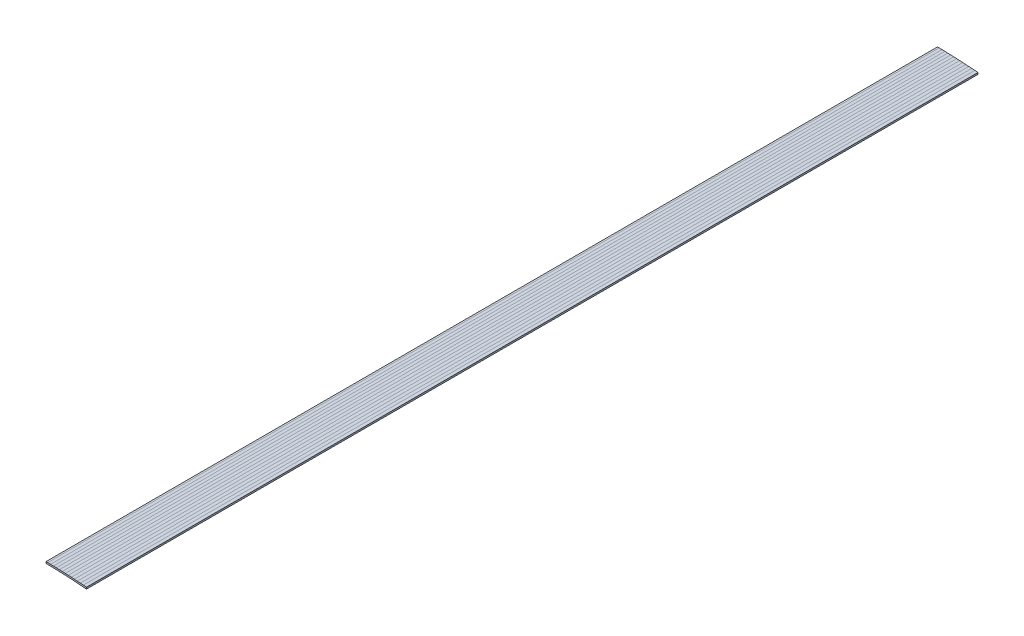
ISO-10303-21;
HEADER;
FILE_DESCRIPTION(('STEP AP214'),'2;1');
FILE_NAME('part.step','',(''),(''),'','','');
FILE_SCHEMA(('AUTOMOTIVE_DESIGN { 1 0 10303 214 1 1 1 1 }'));
ENDSEC;
DATA;
#1=APPLICATION_CONTEXT('core data for automotive mechanical design processes');
#2=APPLICATION_PROTOCOL_DEFINITION('international standard','automotive_design',2000,#1);
#3=PRODUCT_CONTEXT('',#1,'mechanical');
#4=PRODUCT('Part','Part','',(#3));
#5=PRODUCT_RELATED_PRODUCT_CATEGORY('part','',(#4));
#6=PRODUCT_DEFINITION_FORMATION('','',#4);
#7=PRODUCT_DEFINITION_CONTEXT('part definition',#1,'design');
#8=PRODUCT_DEFINITION('design','',#6,#7);
#9=PRODUCT_DEFINITION_SHAPE('','',#8);
#10=(LENGTH_UNIT() NAMED_UNIT(*) SI_UNIT(.MILLI.,.METRE.));
#11=(NAMED_UNIT(*) PLANE_ANGLE_UNIT() SI_UNIT($,.RADIAN.));
#12=(NAMED_UNIT(*) SI_UNIT($,.STERADIAN.) SOLID_ANGLE_UNIT());
#13=UNCERTAINTY_MEASURE_WITH_UNIT(LENGTH_MEASURE(1.E-05),#10,'distance_accuracy_value','');
#14=(GEOMETRIC_REPRESENTATION_CONTEXT(3) GLOBAL_UNCERTAINTY_ASSIGNED_CONTEXT((#13)) GLOBAL_UNIT_ASSIGNED_CONTEXT((#10,
#11,#12)) REPRESENTATION_CONTEXT('',''));
#15=CARTESIAN_POINT('',(0.,0.,0.));
#16=DIRECTION('',(0.,0.,1.));
#17=DIRECTION('',(1.,0.,0.));
#18=AXIS2_PLACEMENT_3D('',#15,#16,#17);
#19=CARTESIAN_POINT('',(12.,2.02787441749079,220.));
#20=DIRECTION('',(-0.00779734988343685,-0.999969600205324,0.));
#21=DIRECTION('',(0.999969600205324,-0.00779734988343685,0.));
#22=AXIS2_PLACEMENT_3D('',#19,#20,#21);
#23=PLANE('',#22);
#24=DIRECTION('',(-0.999969600205324,0.00779734988343685,0.));
#25=VECTOR('',#24,1.);
#26=CARTESIAN_POINT('',(12.,2.02787441749079,0.));
#27=LINE('',#26,#25);
#28=CARTESIAN_POINT('',(12.4208971980884,2.02459243500074,0.));
#29=VERTEX_POINT('',#28);
#30=CARTESIAN_POINT('',(12.,2.02787441749079,0.));
#31=VERTEX_POINT('',#30);
#32=EDGE_CURVE('E282',#29,#31,#27,.T.);
#33=ORIENTED_EDGE('',*,*,#32,.T.);
#34=DIRECTION('',(0.,0.,-1.));
#35=VECTOR('',#34,1.);
#36=CARTESIAN_POINT('',(12.,2.02787441749079,220.));
#37=LINE('',#36,#35);
#38=CARTESIAN_POINT('',(12.,2.02787441749079,220.));
#39=VERTEX_POINT('',#38);
#40=EDGE_CURVE('E11',#39,#31,#37,.T.);
#41=ORIENTED_EDGE('',*,*,#40,.F.);
#42=DIRECTION('',(-0.999969600205324,0.00779734988343685,0.));
#43=VECTOR('',#42,1.);
#44=CARTESIAN_POINT('',(12.,2.02787441749079,220.));
#45=LINE('',#44,#43);
#46=CARTESIAN_POINT('',(12.4208971980884,2.02459243500074,220.));
#47=VERTEX_POINT('',#46);
#48=EDGE_CURVE('E345',#47,#39,#45,.T.);
#49=ORIENTED_EDGE('',*,*,#48,.F.);
#50=DIRECTION('',(0.,0.,-1.));
#51=VECTOR('',#50,1.);
#52=CARTESIAN_POINT('',(12.4208971980884,2.02459243500074,220.));
#53=LINE('',#52,#51);
#54=EDGE_CURVE('E280',#47,#29,#53,.T.);
#55=ORIENTED_EDGE('',*,*,#54,.T.);
#56=EDGE_LOOP('',(#33,#41,#49,#55));
#57=FACE_BOUND('',#56,.T.);
#58=ADVANCED_FACE('F41',(#57),#23,.F.);
#59=CARTESIAN_POINT('',(12.,1.62786225720325,220.));
#60=DIRECTION('',(1.,0.,0.));
#61=DIRECTION('',(0.,0.,-1.));
#62=AXIS2_PLACEMENT_3D('',#59,#60,#61);
#63=PLANE('',#62);
#64=DIRECTION('',(0.,-1.,0.));
#65=VECTOR('',#64,1.);
#66=CARTESIAN_POINT('',(12.,1.62786225720325,0.));
#67=LINE('',#66,#65);
#68=CARTESIAN_POINT('',(12.,1.62786225720325,0.));
#69=VERTEX_POINT('',#68);
#70=EDGE_CURVE('E281',#31,#69,#67,.T.);
#71=ORIENTED_EDGE('',*,*,#70,.T.);
#72=DIRECTION('',(0.,0.,-1.));
#73=VECTOR('',#72,1.);
#74=CARTESIAN_POINT('',(12.,1.62786225720325,220.));
#75=LINE('',#74,#73);
#76=CARTESIAN_POINT('',(12.,1.62786225720325,220.));
#77=VERTEX_POINT('',#76);
#78=EDGE_CURVE('E47',#77,#69,#75,.T.);
#79=ORIENTED_EDGE('',*,*,#78,.F.);
#80=DIRECTION('',(0.,-1.,0.));
#81=VECTOR('',#80,1.);
#82=CARTESIAN_POINT('',(12.,1.62786225720325,220.));
#83=LINE('',#82,#81);
#84=EDGE_CURVE('E175',#39,#77,#83,.T.);
#85=ORIENTED_EDGE('',*,*,#84,.F.);
#86=ORIENTED_EDGE('',*,*,#40,.T.);
#87=EDGE_LOOP('',(#71,#79,#85,#86));
#88=FACE_BOUND('',#87,.T.);
#89=ADVANCED_FACE('F522',(#88),#63,.F.);
#90=CARTESIAN_POINT('',(12.4162912501855,1.62461618999236,220.));
#91=DIRECTION('',(0.00779734988343794,0.999969600205324,0.));
#92=DIRECTION('',(-0.999969600205324,0.00779734988343794,0.));
#93=AXIS2_PLACEMENT_3D('',#90,#91,#92);
#94=PLANE('',#93);
#95=DIRECTION('',(0.999969600205324,-0.00779734988343794,0.));
#96=VECTOR('',#95,1.);
#97=CARTESIAN_POINT('',(12.4162912501855,1.62461618999236,0.));
#98=LINE('',#97,#96);
#99=CARTESIAN_POINT('',(12.4162912501855,1.62461618999236,0.));
#100=VERTEX_POINT('',#99);
#101=EDGE_CURVE('E287',#69,#100,#98,.T.);
#102=ORIENTED_EDGE('',*,*,#101,.T.);
#103=DIRECTION('',(0.,0.,-1.));
#104=VECTOR('',#103,1.);
#105=CARTESIAN_POINT('',(12.4162912501855,1.62461618999236,220.));
#106=LINE('',#105,#104);
#107=CARTESIAN_POINT('',(12.4162912501855,1.62461618999236,220.));
#108=VERTEX_POINT('',#107);
#109=EDGE_CURVE('E424',#108,#100,#106,.T.);
#110=ORIENTED_EDGE('',*,*,#109,.F.);
#111=DIRECTION('',(0.999969600205324,-0.00779734988343794,0.));
#112=VECTOR('',#111,1.);
#113=CARTESIAN_POINT('',(12.4162912501855,1.62461618999236,220.));
#114=LINE('',#113,#112);
#115=EDGE_CURVE('E428',#77,#108,#114,.T.);
#116=ORIENTED_EDGE('',*,*,#115,.F.);
#117=ORIENTED_EDGE('',*,*,#78,.T.);
#118=EDGE_LOOP('',(#102,#110,#116,#117));
#119=FACE_BOUND('',#118,.T.);
#120=ADVANCED_FACE('F426',(#119),#94,.F.);
#121=CARTESIAN_POINT('',(13.1165021581669,1.61394928996735,220.));
#122=DIRECTION('',(0.0152320713458354,0.999883985271549,0.));
#123=DIRECTION('',(-0.999883985271549,0.0152320713458354,0.));
#124=AXIS2_PLACEMENT_3D('',#121,#122,#123);
#125=PLANE('',#124);
#126=DIRECTION('',(0.999883985271549,-0.0152320713458354,0.));
#127=VECTOR('',#126,1.);
#128=CARTESIAN_POINT('',(13.1165021581669,1.61394928996735,0.));
#129=LINE('',#128,#127);
#130=CARTESIAN_POINT('',(13.1165021581669,1.61394928996735,0.));
#131=VERTEX_POINT('',#130);
#132=EDGE_CURVE('E290',#100,#131,#129,.T.);
#133=ORIENTED_EDGE('',*,*,#132,.T.);
#134=DIRECTION('',(0.,0.,-1.));
#135=VECTOR('',#134,1.);
#136=CARTESIAN_POINT('',(13.1165021581669,1.61394928996735,220.));
#137=LINE('',#136,#135);
#138=CARTESIAN_POINT('',(13.1165021581669,1.61394928996735,220.));
#139=VERTEX_POINT('',#138);
#140=EDGE_CURVE('E416',#139,#131,#137,.T.);
#141=ORIENTED_EDGE('',*,*,#140,.F.);
#142=DIRECTION('',(0.999883985271549,-0.0152320713458354,0.));
#143=VECTOR('',#142,1.);
#144=CARTESIAN_POINT('',(13.1165021581669,1.61394928996735,220.));
#145=LINE('',#144,#143);
#146=EDGE_CURVE('E448',#108,#139,#145,.T.);
#147=ORIENTED_EDGE('',*,*,#146,.F.);
#148=ORIENTED_EDGE('',*,*,#109,.T.);
#149=EDGE_LOOP('',(#133,#141,#147,#148));
#150=FACE_BOUND('',#149,.T.);
#151=ADVANCED_FACE('F440',(#150),#125,.F.);
#152=CARTESIAN_POINT('',(13.8260432724261,1.59817310834428,220.));
#153=DIRECTION('',(0.0222288506569368,0.999752908572149,0.));
#154=DIRECTION('',(-0.999752908572149,0.0222288506569368,0.));
#155=AXIS2_PLACEMENT_3D('',#152,#153,#154);
#156=PLANE('',#155);
#157=DIRECTION('',(0.999752908572149,-0.0222288506569368,0.));
#158=VECTOR('',#157,1.);
#159=CARTESIAN_POINT('',(13.8260432724261,1.59817310834428,0.));
#160=LINE('',#159,#158);
#161=CARTESIAN_POINT('',(13.8260432724261,1.59817310834428,0.));
#162=VERTEX_POINT('',#161);
#163=EDGE_CURVE('E288',#131,#162,#160,.T.);
#164=ORIENTED_EDGE('',*,*,#163,.T.);
#165=DIRECTION('',(0.,0.,-1.));
#166=VECTOR('',#165,1.);
#167=CARTESIAN_POINT('',(13.8260432724261,1.59817310834428,220.));
#168=LINE('',#167,#166);
#169=CARTESIAN_POINT('',(13.8260432724261,1.59817310834428,220.));
#170=VERTEX_POINT('',#169);
#171=EDGE_CURVE('E417',#170,#162,#168,.T.);
#172=ORIENTED_EDGE('',*,*,#171,.F.);
#173=DIRECTION('',(0.999752908572149,-0.0222288506569368,0.));
#174=VECTOR('',#173,1.);
#175=CARTESIAN_POINT('',(13.8260432724261,1.59817310834428,220.));
#176=LINE('',#175,#174);
#177=EDGE_CURVE('E442',#139,#170,#176,.T.);
#178=ORIENTED_EDGE('',*,*,#177,.F.);
#179=ORIENTED_EDGE('',*,*,#140,.T.);
#180=EDGE_LOOP('',(#164,#172,#178,#179));
#181=FACE_BOUND('',#180,.T.);
#182=ADVANCED_FACE('F441',(#181),#156,.F.);
#183=CARTESIAN_POINT('',(14.5437988273589,1.5774851569678,220.));
#184=DIRECTION('',(0.0288111503975783,0.999584872641022,0.));
#185=DIRECTION('',(-0.999584872641022,0.0288111503975783,0.));
#186=AXIS2_PLACEMENT_3D('',#183,#184,#185);
#187=PLANE('',#186);
#188=DIRECTION('',(0.999584872641022,-0.0288111503975783,0.));
#189=VECTOR('',#188,1.);
#190=CARTESIAN_POINT('',(14.5437988273589,1.5774851569678,0.));
#191=LINE('',#190,#189);
#192=CARTESIAN_POINT('',(14.5437988273589,1.5774851569678,0.));
#193=VERTEX_POINT('',#192);
#194=EDGE_CURVE('E295',#162,#193,#191,.T.);
#195=ORIENTED_EDGE('',*,*,#194,.T.);
#196=DIRECTION('',(0.,0.,-1.));
#197=VECTOR('',#196,1.);
#198=CARTESIAN_POINT('',(14.5437988273589,1.5774851569678,220.));
#199=LINE('',#198,#197);
#200=CARTESIAN_POINT('',(14.5437988273589,1.5774851569678,220.));
#201=VERTEX_POINT('',#200);
#202=EDGE_CURVE('E412',#201,#193,#199,.T.);
#203=ORIENTED_EDGE('',*,*,#202,.F.);
#204=DIRECTION('',(0.999584872641022,-0.0288111503975783,0.));
#205=VECTOR('',#204,1.);
#206=CARTESIAN_POINT('',(14.5437988273589,1.5774851569678,220.));
#207=LINE('',#206,#205);
#208=EDGE_CURVE('E450',#170,#201,#207,.T.);
#209=ORIENTED_EDGE('',*,*,#208,.F.);
#210=ORIENTED_EDGE('',*,*,#171,.T.);
#211=EDGE_LOOP('',(#195,#203,#209,#210));
#212=FACE_BOUND('',#211,.T.);
#213=ADVANCED_FACE('F534',(#212),#187,.F.);
#214=CARTESIAN_POINT('',(15.2686414152349,1.55209913770248,220.));
#215=DIRECTION('',(0.035001343455341,0.999387265256228,0.));
#216=DIRECTION('',(-0.999387265256228,0.035001343455341,0.));
#217=AXIS2_PLACEMENT_3D('',#214,#215,#216);
#218=PLANE('',#217);
#219=DIRECTION('',(0.999387265256228,-0.035001343455341,0.));
#220=VECTOR('',#219,1.);
#221=CARTESIAN_POINT('',(15.2686414152349,1.55209913770248,0.));
#222=LINE('',#221,#220);
#223=CARTESIAN_POINT('',(15.2686414152349,1.55209913770248,0.));
#224=VERTEX_POINT('',#223);
#225=EDGE_CURVE('E294',#193,#224,#222,.T.);
#226=ORIENTED_EDGE('',*,*,#225,.T.);
#227=DIRECTION('',(0.,0.,-1.));
#228=VECTOR('',#227,1.);
#229=CARTESIAN_POINT('',(15.2686414152349,1.55209913770248,220.));
#230=LINE('',#229,#228);
#231=CARTESIAN_POINT('',(15.2686414152349,1.55209913770248,220.));
#232=VERTEX_POINT('',#231);
#233=EDGE_CURVE('E409',#232,#224,#230,.T.);
#234=ORIENTED_EDGE('',*,*,#233,.F.);
#235=DIRECTION('',(0.999387265256228,-0.035001343455341,0.));
#236=VECTOR('',#235,1.);
#237=CARTESIAN_POINT('',(15.2686414152349,1.55209913770248,220.));
#238=LINE('',#237,#236);
#239=EDGE_CURVE('E449',#201,#232,#238,.T.);
#240=ORIENTED_EDGE('',*,*,#239,.F.);
#241=ORIENTED_EDGE('',*,*,#202,.T.);
#242=EDGE_LOOP('',(#226,#234,#240,#241));
#243=FACE_BOUND('',#242,.T.);
#244=ADVANCED_FACE('F540',(#243),#218,.F.);
#245=CARTESIAN_POINT('',(15.9994335484656,1.52224259514114,220.));
#246=DIRECTION('',(0.0408209873416693,0.999166476115192,0.));
#247=DIRECTION('',(-0.999166476115192,0.0408209873416693,0.));
#248=AXIS2_PLACEMENT_3D('',#245,#246,#247);
#249=PLANE('',#248);
#250=DIRECTION('',(0.999166476115192,-0.0408209873416693,0.));
#251=VECTOR('',#250,1.);
#252=CARTESIAN_POINT('',(15.9994335484656,1.52224259514114,0.));
#253=LINE('',#252,#251);
#254=CARTESIAN_POINT('',(15.9994335484656,1.52224259514114,0.));
#255=VERTEX_POINT('',#254);
#256=EDGE_CURVE('E297',#224,#255,#253,.T.);
#257=ORIENTED_EDGE('',*,*,#256,.T.);
#258=DIRECTION('',(0.,0.,-1.));
#259=VECTOR('',#258,1.);
#260=CARTESIAN_POINT('',(15.9994335484656,1.52224259514114,220.));
#261=LINE('',#260,#259);
#262=CARTESIAN_POINT('',(15.9994335484656,1.52224259514114,220.));
#263=VERTEX_POINT('',#262);
#264=EDGE_CURVE('E410',#263,#255,#261,.T.);
#265=ORIENTED_EDGE('',*,*,#264,.F.);
#266=DIRECTION('',(0.999166476115192,-0.0408209873416693,0.));
#267=VECTOR('',#266,1.);
#268=CARTESIAN_POINT('',(15.9994335484656,1.52224259514114,220.));
#269=LINE('',#268,#267);
#270=EDGE_CURVE('E456',#232,#263,#269,.T.);
#271=ORIENTED_EDGE('',*,*,#270,.F.);
#272=ORIENTED_EDGE('',*,*,#233,.T.);
#273=EDGE_LOOP('',(#257,#265,#271,#272));
#274=FACE_BOUND('',#273,.T.);
#275=ADVANCED_FACE('F541',(#274),#249,.F.);
#276=CARTESIAN_POINT('',(16.7350292827461,1.48815457307719,220.));
#277=DIRECTION('',(0.0462910236967297,0.99892799596623,0.));
#278=DIRECTION('',(-0.99892799596623,0.0462910236967297,0.));
#279=AXIS2_PLACEMENT_3D('',#276,#277,#278);
#280=PLANE('',#279);
#281=DIRECTION('',(0.99892799596623,-0.0462910236967297,0.));
#282=VECTOR('',#281,1.);
#283=CARTESIAN_POINT('',(16.7350292827461,1.48815457307719,0.));
#284=LINE('',#283,#282);
#285=CARTESIAN_POINT('',(16.7350292827461,1.48815457307719,0.));
#286=VERTEX_POINT('',#285);
#287=EDGE_CURVE('E300',#255,#286,#284,.T.);
#288=ORIENTED_EDGE('',*,*,#287,.T.);
#289=DIRECTION('',(0.,0.,-1.));
#290=VECTOR('',#289,1.);
#291=CARTESIAN_POINT('',(16.7350292827461,1.48815457307719,220.));
#292=LINE('',#291,#290);
#293=CARTESIAN_POINT('',(16.7350292827461,1.48815457307719,220.));
#294=VERTEX_POINT('',#293);
#295=EDGE_CURVE('E402',#294,#286,#292,.T.);
#296=ORIENTED_EDGE('',*,*,#295,.F.);
#297=DIRECTION('',(0.99892799596623,-0.0462910236967297,0.));
#298=VECTOR('',#297,1.);
#299=CARTESIAN_POINT('',(16.7350292827461,1.48815457307719,220.));
#300=LINE('',#299,#298);
#301=EDGE_CURVE('E457',#263,#294,#300,.T.);
#302=ORIENTED_EDGE('',*,*,#301,.F.);
#303=ORIENTED_EDGE('',*,*,#264,.T.);
#304=EDGE_LOOP('',(#288,#296,#302,#303));
#305=FACE_BOUND('',#304,.T.);
#306=ADVANCED_FACE('F544',(#305),#280,.F.);
#307=CARTESIAN_POINT('',(17.4742758909573,1.45008331687681,220.));
#308=DIRECTION('',(0.0514319154027312,0.998676503217136,0.));
#309=DIRECTION('',(-0.998676503217136,0.0514319154027312,0.));
#310=AXIS2_PLACEMENT_3D('',#307,#308,#309);
#311=PLANE('',#310);
#312=DIRECTION('',(0.998676503217136,-0.0514319154027312,0.));
#313=VECTOR('',#312,1.);
#314=CARTESIAN_POINT('',(17.4742758909573,1.45008331687681,0.));
#315=LINE('',#314,#313);
#316=CARTESIAN_POINT('',(17.4742758909573,1.45008331687681,0.));
#317=VERTEX_POINT('',#316);
#318=EDGE_CURVE('E298',#286,#317,#315,.T.);
#319=ORIENTED_EDGE('',*,*,#318,.T.);
#320=DIRECTION('',(0.,0.,-1.));
#321=VECTOR('',#320,1.);
#322=CARTESIAN_POINT('',(17.4742758909573,1.45008331687681,220.));
#323=LINE('',#322,#321);
#324=CARTESIAN_POINT('',(17.4742758909573,1.45008331687681,220.));
#325=VERTEX_POINT('',#324);
#326=EDGE_CURVE('E401',#325,#317,#323,.T.);
#327=ORIENTED_EDGE('',*,*,#326,.F.);
#328=DIRECTION('',(0.998676503217136,-0.0514319154027312,0.));
#329=VECTOR('',#328,1.);
#330=CARTESIAN_POINT('',(17.4742758909573,1.45008331687681,220.));
#331=LINE('',#330,#329);
#332=EDGE_CURVE('E459',#294,#325,#331,.T.);
#333=ORIENTED_EDGE('',*,*,#332,.F.);
#334=ORIENTED_EDGE('',*,*,#295,.T.);
#335=EDGE_LOOP('',(#319,#327,#333,#334));
#336=FACE_BOUND('',#335,.T.);
#337=ADVANCED_FACE('F548',(#336),#311,.F.);
#338=CARTESIAN_POINT('',(18.2160155788332,1.40828406157576,220.));
#339=DIRECTION('',(0.0562637317682948,0.998415941623282,0.));
#340=DIRECTION('',(-0.998415941623282,0.0562637317682948,0.));
#341=AXIS2_PLACEMENT_3D('',#338,#339,#340);
#342=PLANE('',#341);
#343=DIRECTION('',(0.998415941623282,-0.0562637317682948,0.));
#344=VECTOR('',#343,1.);
#345=CARTESIAN_POINT('',(18.2160155788332,1.40828406157576,0.));
#346=LINE('',#345,#344);
#347=CARTESIAN_POINT('',(18.2160155788332,1.40828406157576,0.));
#348=VERTEX_POINT('',#347);
#349=EDGE_CURVE('E302',#317,#348,#346,.T.);
#350=ORIENTED_EDGE('',*,*,#349,.T.);
#351=DIRECTION('',(0.,0.,-1.));
#352=VECTOR('',#351,1.);
#353=CARTESIAN_POINT('',(18.2160155788332,1.40828406157576,220.));
#354=LINE('',#353,#352);
#355=CARTESIAN_POINT('',(18.2160155788332,1.40828406157576,220.));
#356=VERTEX_POINT('',#355);
#357=EDGE_CURVE('E396',#356,#348,#354,.T.);
#358=ORIENTED_EDGE('',*,*,#357,.F.);
#359=DIRECTION('',(0.998415941623282,-0.0562637317682948,0.));
#360=VECTOR('',#359,1.);
#361=CARTESIAN_POINT('',(18.2160155788332,1.40828406157576,220.));
#362=LINE('',#361,#360);
#363=EDGE_CURVE('E465',#325,#356,#362,.T.);
#364=ORIENTED_EDGE('',*,*,#363,.F.);
#365=ORIENTED_EDGE('',*,*,#326,.T.);
#366=EDGE_LOOP('',(#350,#358,#364,#365));
#367=FACE_BOUND('',#366,.T.);
#368=ADVANCED_FACE('F554',(#367),#342,.F.);
#369=CARTESIAN_POINT('',(18.9590872342926,1.36301694213588,220.));
#370=DIRECTION('',(0.0608061906937295,0.998149591581,0.));
#371=DIRECTION('',(-0.998149591581,0.0608061906937295,0.));
#372=AXIS2_PLACEMENT_3D('',#369,#370,#371);
#373=PLANE('',#372);
#374=DIRECTION('',(0.998149591581,-0.0608061906937295,0.));
#375=VECTOR('',#374,1.);
#376=CARTESIAN_POINT('',(18.9590872342926,1.36301694213588,0.));
#377=LINE('',#376,#375);
#378=CARTESIAN_POINT('',(18.9590872342926,1.36301694213588,0.));
#379=VERTEX_POINT('',#378);
#380=EDGE_CURVE('E305',#348,#379,#377,.T.);
#381=ORIENTED_EDGE('',*,*,#380,.T.);
#382=DIRECTION('',(0.,0.,-1.));
#383=VECTOR('',#382,1.);
#384=CARTESIAN_POINT('',(18.9590872342926,1.36301694213588,220.));
#385=LINE('',#384,#383);
#386=CARTESIAN_POINT('',(18.9590872342926,1.36301694213588,220.));
#387=VERTEX_POINT('',#386);
#388=EDGE_CURVE('E394',#387,#379,#385,.T.);
#389=ORIENTED_EDGE('',*,*,#388,.F.);
#390=DIRECTION('',(0.998149591581,-0.0608061906937295,0.));
#391=VECTOR('',#390,1.);
#392=CARTESIAN_POINT('',(18.9590872342926,1.36301694213588,220.));
#393=LINE('',#392,#391);
#394=EDGE_CURVE('E461',#356,#387,#393,.T.);
#395=ORIENTED_EDGE('',*,*,#394,.F.);
#396=ORIENTED_EDGE('',*,*,#357,.T.);
#397=EDGE_LOOP('',(#381,#389,#395,#396));
#398=FACE_BOUND('',#397,.T.);
#399=ADVANCED_FACE('F559',(#398),#373,.F.);
#400=CARTESIAN_POINT('',(19.7023282030514,1.31454505798701,220.));
#401=DIRECTION('',(0.0650786654875173,0.997880136739059,0.));
#402=DIRECTION('',(-0.99788013673906,0.0650786654875173,0.));
#403=AXIS2_PLACEMENT_3D('',#400,#401,#402);
#404=PLANE('',#403);
#405=DIRECTION('',(0.997880136739059,-0.0650786654875173,0.));
#406=VECTOR('',#405,1.);
#407=CARTESIAN_POINT('',(19.7023282030514,1.31454505798701,0.));
#408=LINE('',#407,#406);
#409=CARTESIAN_POINT('',(19.7023282030514,1.31454505798701,0.));
#410=VERTEX_POINT('',#409);
#411=EDGE_CURVE('E308',#379,#410,#408,.T.);
#412=ORIENTED_EDGE('',*,*,#411,.T.);
#413=DIRECTION('',(0.,0.,-1.));
#414=VECTOR('',#413,1.);
#415=CARTESIAN_POINT('',(19.7023282030514,1.31454505798701,220.));
#416=LINE('',#415,#414);
#417=CARTESIAN_POINT('',(19.7023282030514,1.31454505798701,220.));
#418=VERTEX_POINT('',#417);
#419=EDGE_CURVE('E392',#418,#410,#416,.T.);
#420=ORIENTED_EDGE('',*,*,#419,.F.);
#421=DIRECTION('',(0.997880136739059,-0.0650786654875173,0.));
#422=VECTOR('',#421,1.);
#423=CARTESIAN_POINT('',(19.7023282030514,1.31454505798701,220.));
#424=LINE('',#423,#422);
#425=EDGE_CURVE('E467',#387,#418,#424,.T.);
#426=ORIENTED_EDGE('',*,*,#425,.F.);
#427=ORIENTED_EDGE('',*,*,#388,.T.);
#428=EDGE_LOOP('',(#412,#420,#426,#427));
#429=FACE_BOUND('',#428,.T.);
#430=ADVANCED_FACE('F562',(#429),#404,.F.);
#431=CARTESIAN_POINT('',(20.4445760837068,1.26313271891831,220.));
#432=DIRECTION('',(0.0691001630064702,0.997609727033813,0.));
#433=DIRECTION('',(-0.997609727033813,0.0691001630064702,0.));
#434=AXIS2_PLACEMENT_3D('',#431,#432,#433);
#435=PLANE('',#434);
#436=DIRECTION('',(0.997609727033813,-0.0691001630064702,0.));
#437=VECTOR('',#436,1.);
#438=CARTESIAN_POINT('',(20.4445760837068,1.26313271891831,0.));
#439=LINE('',#438,#437);
#440=CARTESIAN_POINT('',(20.4445760837068,1.26313271891831,0.));
#441=VERTEX_POINT('',#440);
#442=EDGE_CURVE('E306',#410,#441,#439,.T.);
#443=ORIENTED_EDGE('',*,*,#442,.T.);
#444=DIRECTION('',(0.,0.,-1.));
#445=VECTOR('',#444,1.);
#446=CARTESIAN_POINT('',(20.4445760837068,1.26313271891831,220.));
#447=LINE('',#446,#445);
#448=CARTESIAN_POINT('',(20.4445760837068,1.26313271891831,220.));
#449=VERTEX_POINT('',#448);
#450=EDGE_CURVE('E386',#449,#441,#447,.T.);
#451=ORIENTED_EDGE('',*,*,#450,.F.);
#452=DIRECTION('',(0.997609727033813,-0.0691001630064702,0.));
#453=VECTOR('',#452,1.);
#454=CARTESIAN_POINT('',(20.4445760837068,1.26313271891831,220.));
#455=LINE('',#454,#453);
#456=EDGE_CURVE('E470',#418,#449,#455,.T.);
#457=ORIENTED_EDGE('',*,*,#456,.F.);
#458=ORIENTED_EDGE('',*,*,#419,.T.);
#459=EDGE_LOOP('',(#443,#451,#457,#458));
#460=FACE_BOUND('',#459,.T.);
#461=ADVANCED_FACE('F563',(#460),#435,.F.);
#462=CARTESIAN_POINT('',(21.1846705359667,1.20904389373843,220.));
#463=DIRECTION('',(0.0728892789822354,0.997340038807953,0.));
#464=DIRECTION('',(-0.997340038807954,0.0728892789822355,0.));
#465=AXIS2_PLACEMENT_3D('',#462,#463,#464);
#466=PLANE('',#465);
#467=DIRECTION('',(0.997340038807953,-0.0728892789822354,0.));
#468=VECTOR('',#467,1.);
#469=CARTESIAN_POINT('',(21.1846705359667,1.20904389373843,0.));
#470=LINE('',#469,#468);
#471=CARTESIAN_POINT('',(21.1846705359667,1.20904389373843,0.));
#472=VERTEX_POINT('',#471);
#473=EDGE_CURVE('E307',#441,#472,#470,.T.);
#474=ORIENTED_EDGE('',*,*,#473,.T.);
#475=DIRECTION('',(0.,0.,-1.));
#476=VECTOR('',#475,1.);
#477=CARTESIAN_POINT('',(21.1846705359667,1.20904389373843,220.));
#478=LINE('',#477,#476);
#479=CARTESIAN_POINT('',(21.1846705359667,1.20904389373843,220.));
#480=VERTEX_POINT('',#479);
#481=EDGE_CURVE('E387',#480,#472,#478,.T.);
#482=ORIENTED_EDGE('',*,*,#481,.F.);
#483=DIRECTION('',(0.997340038807953,-0.0728892789822354,0.));
#484=VECTOR('',#483,1.);
#485=CARTESIAN_POINT('',(21.1846705359667,1.20904389373843,220.));
#486=LINE('',#485,#484);
#487=EDGE_CURVE('E468',#449,#480,#486,.T.);
#488=ORIENTED_EDGE('',*,*,#487,.F.);
#489=ORIENTED_EDGE('',*,*,#450,.T.);
#490=EDGE_LOOP('',(#474,#482,#488,#489));
#491=FACE_BOUND('',#490,.T.);
#492=ADVANCED_FACE('F566',(#491),#466,.F.);
#493=CARTESIAN_POINT('',(21.9214550960875,1.1525408770745,220.));
#494=DIRECTION('',(0.0764641357318034,0.997072332354473,0.));
#495=DIRECTION('',(-0.997072332354473,0.0764641357318034,0.));
#496=AXIS2_PLACEMENT_3D('',#493,#494,#495);
#497=PLANE('',#496);
#498=DIRECTION('',(0.997072332354473,-0.0764641357318034,0.));
#499=VECTOR('',#498,1.);
#500=CARTESIAN_POINT('',(21.9214550960875,1.1525408770745,0.));
#501=LINE('',#500,#499);
#502=CARTESIAN_POINT('',(21.9214550960875,1.1525408770745,0.));
#503=VERTEX_POINT('',#502);
#504=EDGE_CURVE('E315',#472,#503,#501,.T.);
#505=ORIENTED_EDGE('',*,*,#504,.T.);
#506=DIRECTION('',(0.,0.,-1.));
#507=VECTOR('',#506,1.);
#508=CARTESIAN_POINT('',(21.9214550960875,1.1525408770745,220.));
#509=LINE('',#508,#507);
#510=CARTESIAN_POINT('',(21.9214550960875,1.1525408770745,220.));
#511=VERTEX_POINT('',#510);
#512=EDGE_CURVE('E381',#511,#503,#509,.T.);
#513=ORIENTED_EDGE('',*,*,#512,.F.);
#514=DIRECTION('',(0.997072332354473,-0.0764641357318034,0.));
#515=VECTOR('',#514,1.);
#516=CARTESIAN_POINT('',(21.9214550960875,1.1525408770745,220.));
#517=LINE('',#516,#515);
#518=EDGE_CURVE('E475',#480,#511,#517,.T.);
#519=ORIENTED_EDGE('',*,*,#518,.F.);
#520=ORIENTED_EDGE('',*,*,#481,.T.);
#521=EDGE_LOOP('',(#505,#513,#519,#520));
#522=FACE_BOUND('',#521,.T.);
#523=ADVANCED_FACE('F571',(#522),#497,.F.);
#524=CARTESIAN_POINT('',(22.,1.14624958584804,220.));
#525=DIRECTION('',(0.0798423068961165,0.996807507009004,0.));
#526=DIRECTION('',(-0.996807507009005,0.0798423068961166,0.));
#527=AXIS2_PLACEMENT_3D('',#524,#525,#526);
#528=PLANE('',#527);
#529=DIRECTION('',(0.996807507009004,-0.0798423068961165,0.));
#530=VECTOR('',#529,1.);
#531=CARTESIAN_POINT('',(22.,1.14624958584804,0.));
#532=LINE('',#531,#530);
#533=CARTESIAN_POINT('',(22.,1.14624958584804,0.));
#534=VERTEX_POINT('',#533);
#535=EDGE_CURVE('E312',#503,#534,#532,.T.);
#536=ORIENTED_EDGE('',*,*,#535,.T.);
#537=DIRECTION('',(0.,0.,-1.));
#538=VECTOR('',#537,1.);
#539=CARTESIAN_POINT('',(22.,1.14624958584804,220.));
#540=LINE('',#539,#538);
#541=CARTESIAN_POINT('',(22.,1.14624958584804,220.));
#542=VERTEX_POINT('',#541);
#543=EDGE_CURVE('E378',#542,#534,#540,.T.);
#544=ORIENTED_EDGE('',*,*,#543,.F.);
#545=DIRECTION('',(0.996807507009004,-0.0798423068961165,0.));
#546=VECTOR('',#545,1.);
#547=CARTESIAN_POINT('',(22.,1.14624958584804,220.));
#548=LINE('',#547,#546);
#549=EDGE_CURVE('E474',#511,#542,#548,.T.);
#550=ORIENTED_EDGE('',*,*,#549,.F.);
#551=ORIENTED_EDGE('',*,*,#512,.T.);
#552=EDGE_LOOP('',(#536,#544,#550,#551));
#553=FACE_BOUND('',#552,.T.);
#554=ADVANCED_FACE('F580',(#553),#528,.F.);
#555=CARTESIAN_POINT('',(22.,1.5475306729059,220.));
#556=DIRECTION('',(-1.,0.,0.));
#557=DIRECTION('',(0.,0.,1.));
#558=AXIS2_PLACEMENT_3D('',#555,#556,#557);
#559=PLANE('',#558);
#560=DIRECTION('',(0.,1.,0.));
#561=VECTOR('',#560,1.);
#562=CARTESIAN_POINT('',(22.,1.5475306729059,0.));
#563=LINE('',#562,#561);
#564=CARTESIAN_POINT('',(22.,1.5475306729059,0.));
#565=VERTEX_POINT('',#564);
#566=EDGE_CURVE('E316',#534,#565,#563,.T.);
#567=ORIENTED_EDGE('',*,*,#566,.T.);
#568=DIRECTION('',(0.,0.,-1.));
#569=VECTOR('',#568,1.);
#570=CARTESIAN_POINT('',(22.,1.5475306729059,220.));
#571=LINE('',#570,#569);
#572=CARTESIAN_POINT('',(22.,1.5475306729059,220.));
#573=VERTEX_POINT('',#572);
#574=EDGE_CURVE('E379',#573,#565,#571,.T.);
#575=ORIENTED_EDGE('',*,*,#574,.F.);
#576=DIRECTION('',(0.,1.,0.));
#577=VECTOR('',#576,1.);
#578=CARTESIAN_POINT('',(22.,1.5475306729059,220.));
#579=LINE('',#578,#577);
#580=EDGE_CURVE('E477',#542,#573,#579,.T.);
#581=ORIENTED_EDGE('',*,*,#580,.F.);
#582=ORIENTED_EDGE('',*,*,#543,.T.);
#583=EDGE_LOOP('',(#567,#575,#581,#582));
#584=FACE_BOUND('',#583,.T.);
#585=ADVANCED_FACE('F581',(#584),#559,.F.);
#586=CARTESIAN_POINT('',(21.9527164743502,1.55131798965413,220.));
#587=DIRECTION('',(-0.0798423068961218,-0.996807507009004,0.));
#588=DIRECTION('',(0.996807507009004,-0.0798423068961218,0.));
#589=AXIS2_PLACEMENT_3D('',#586,#587,#588);
#590=PLANE('',#589);
#591=DIRECTION('',(-0.996807507009004,0.0798423068961218,0.));
#592=VECTOR('',#591,1.);
#593=CARTESIAN_POINT('',(21.9527164743502,1.55131798965413,0.));
#594=LINE('',#593,#592);
#595=CARTESIAN_POINT('',(21.9527164743502,1.55131798965413,0.));
#596=VERTEX_POINT('',#595);
#597=EDGE_CURVE('E318',#565,#596,#594,.T.);
#598=ORIENTED_EDGE('',*,*,#597,.T.);
#599=DIRECTION('',(0.,0.,-1.));
#600=VECTOR('',#599,1.);
#601=CARTESIAN_POINT('',(21.9527164743502,1.55131798965413,220.));
#602=LINE('',#601,#600);
#603=CARTESIAN_POINT('',(21.9527164743502,1.55131798965413,220.));
#604=VERTEX_POINT('',#603);
#605=EDGE_CURVE('E371',#604,#596,#602,.T.);
#606=ORIENTED_EDGE('',*,*,#605,.F.);
#607=DIRECTION('',(-0.996807507009004,0.0798423068961218,0.));
#608=VECTOR('',#607,1.);
#609=CARTESIAN_POINT('',(21.9527164743502,1.55131798965413,220.));
#610=LINE('',#609,#608);
#611=EDGE_CURVE('E480',#573,#604,#610,.T.);
#612=ORIENTED_EDGE('',*,*,#611,.F.);
#613=ORIENTED_EDGE('',*,*,#574,.T.);
#614=EDGE_LOOP('',(#598,#606,#612,#613));
#615=FACE_BOUND('',#614,.T.);
#616=ADVANCED_FACE('F584',(#615),#590,.F.);
#617=CARTESIAN_POINT('',(21.2145413148788,1.60792764951138,220.));
#618=DIRECTION('',(-0.076464135731803,-0.997072332354473,0.));
#619=DIRECTION('',(0.997072332354473,-0.076464135731803,0.));
#620=AXIS2_PLACEMENT_3D('',#617,#618,#619);
#621=PLANE('',#620);
#622=DIRECTION('',(-0.997072332354473,0.076464135731803,0.));
#623=VECTOR('',#622,1.);
#624=CARTESIAN_POINT('',(21.2145413148788,1.60792764951138,0.));
#625=LINE('',#624,#623);
#626=CARTESIAN_POINT('',(21.2145413148788,1.60792764951138,0.));
#627=VERTEX_POINT('',#626);
#628=EDGE_CURVE('E319',#596,#627,#625,.T.);
#629=ORIENTED_EDGE('',*,*,#628,.T.);
#630=DIRECTION('',(0.,0.,-1.));
#631=VECTOR('',#630,1.);
#632=CARTESIAN_POINT('',(21.2145413148788,1.60792764951138,220.));
#633=LINE('',#632,#631);
#634=CARTESIAN_POINT('',(21.2145413148788,1.60792764951138,220.));
#635=VERTEX_POINT('',#634);
#636=EDGE_CURVE('E372',#635,#627,#633,.T.);
#637=ORIENTED_EDGE('',*,*,#636,.F.);
#638=DIRECTION('',(-0.997072332354473,0.076464135731803,0.));
#639=VECTOR('',#638,1.);
#640=CARTESIAN_POINT('',(21.2145413148788,1.60792764951138,220.));
#641=LINE('',#640,#639);
#642=EDGE_CURVE('E478',#604,#635,#641,.T.);
#643=ORIENTED_EDGE('',*,*,#642,.F.);
#644=ORIENTED_EDGE('',*,*,#605,.T.);
#645=EDGE_LOOP('',(#629,#637,#643,#644));
#646=FACE_BOUND('',#645,.T.);
#647=ADVANCED_FACE('F587',(#646),#621,.F.);
#648=CARTESIAN_POINT('',(20.4729740745513,1.66212411146124,220.));
#649=DIRECTION('',(-0.0728892789822352,-0.997340038807953,0.));
#650=DIRECTION('',(0.997340038807953,-0.0728892789822352,0.));
#651=AXIS2_PLACEMENT_3D('',#648,#649,#650);
#652=PLANE('',#651);
#653=DIRECTION('',(-0.997340038807953,0.0728892789822352,0.));
#654=VECTOR('',#653,1.);
#655=CARTESIAN_POINT('',(20.4729740745513,1.66212411146124,0.));
#656=LINE('',#655,#654);
#657=CARTESIAN_POINT('',(20.4729740745513,1.66212411146124,0.));
#658=VERTEX_POINT('',#657);
#659=EDGE_CURVE('E325',#627,#658,#656,.T.);
#660=ORIENTED_EDGE('',*,*,#659,.T.);
#661=DIRECTION('',(0.,0.,-1.));
#662=VECTOR('',#661,1.);
#663=CARTESIAN_POINT('',(20.4729740745513,1.66212411146124,220.));
#664=LINE('',#663,#662);
#665=CARTESIAN_POINT('',(20.4729740745513,1.66212411146124,220.));
#666=VERTEX_POINT('',#665);
#667=EDGE_CURVE('E367',#666,#658,#664,.T.);
#668=ORIENTED_EDGE('',*,*,#667,.F.);
#669=DIRECTION('',(-0.997340038807953,0.0728892789822352,0.));
#670=VECTOR('',#669,1.);
#671=CARTESIAN_POINT('',(20.4729740745513,1.66212411146124,220.));
#672=LINE('',#671,#670);
#673=EDGE_CURVE('E482',#635,#666,#672,.T.);
#674=ORIENTED_EDGE('',*,*,#673,.F.);
#675=ORIENTED_EDGE('',*,*,#636,.T.);
#676=EDGE_LOOP('',(#660,#668,#674,#675));
#677=FACE_BOUND('',#676,.T.);
#678=ADVANCED_FACE('F592',(#677),#652,.F.);
#679=CARTESIAN_POINT('',(19.7291640777412,1.71364465164105,220.));
#680=DIRECTION('',(-0.0691001630064706,-0.997609727033813,0.));
#681=DIRECTION('',(0.997609727033813,-0.0691001630064706,0.));
#682=AXIS2_PLACEMENT_3D('',#679,#680,#681);
#683=PLANE('',#682);
#684=DIRECTION('',(-0.997609727033813,0.0691001630064706,0.));
#685=VECTOR('',#684,1.);
#686=CARTESIAN_POINT('',(19.7291640777412,1.71364465164105,0.));
#687=LINE('',#686,#685);
#688=CARTESIAN_POINT('',(19.7291640777412,1.71364465164105,0.));
#689=VERTEX_POINT('',#688);
#690=EDGE_CURVE('E323',#658,#689,#687,.T.);
#691=ORIENTED_EDGE('',*,*,#690,.T.);
#692=DIRECTION('',(0.,0.,-1.));
#693=VECTOR('',#692,1.);
#694=CARTESIAN_POINT('',(19.7291640777412,1.71364465164105,220.));
#695=LINE('',#694,#693);
#696=CARTESIAN_POINT('',(19.7291640777412,1.71364465164105,220.));
#697=VERTEX_POINT('',#696);
#698=EDGE_CURVE('E364',#697,#689,#695,.T.);
#699=ORIENTED_EDGE('',*,*,#698,.F.);
#700=DIRECTION('',(-0.997609727033813,0.0691001630064706,0.));
#701=VECTOR('',#700,1.);
#702=CARTESIAN_POINT('',(19.7291640777412,1.71364465164105,220.));
#703=LINE('',#702,#701);
#704=EDGE_CURVE('E485',#666,#697,#703,.T.);
#705=ORIENTED_EDGE('',*,*,#704,.F.);
#706=ORIENTED_EDGE('',*,*,#667,.T.);
#707=EDGE_LOOP('',(#691,#699,#705,#706));
#708=FACE_BOUND('',#707,.T.);
#709=ADVANCED_FACE('F600',(#708),#683,.F.);
#710=CARTESIAN_POINT('',(18.9842643208818,1.76222471683486,220.));
#711=DIRECTION('',(-0.0650786654875169,-0.997880136739059,0.));
#712=DIRECTION('',(0.99788013673906,-0.065078665487517,0.));
#713=AXIS2_PLACEMENT_3D('',#710,#711,#712);
#714=PLANE('',#713);
#715=DIRECTION('',(-0.99788013673906,0.065078665487517,0.));
#716=VECTOR('',#715,1.);
#717=CARTESIAN_POINT('',(18.9842643208818,1.76222471683486,0.));
#718=LINE('',#717,#716);
#719=CARTESIAN_POINT('',(18.9842643208818,1.76222471683486,0.));
#720=VERTEX_POINT('',#719);
#721=EDGE_CURVE('E327',#689,#720,#718,.T.);
#722=ORIENTED_EDGE('',*,*,#721,.T.);
#723=DIRECTION('',(0.,0.,-1.));
#724=VECTOR('',#723,1.);
#725=CARTESIAN_POINT('',(18.9842643208818,1.76222471683486,220.));
#726=LINE('',#725,#724);
#727=CARTESIAN_POINT('',(18.9842643208818,1.76222471683486,220.));
#728=VERTEX_POINT('',#727);
#729=EDGE_CURVE('E365',#728,#720,#726,.T.);
#730=ORIENTED_EDGE('',*,*,#729,.F.);
#731=DIRECTION('',(-0.99788013673906,0.065078665487517,0.));
#732=VECTOR('',#731,1.);
#733=CARTESIAN_POINT('',(18.9842643208818,1.76222471683486,220.));
#734=LINE('',#733,#732);
#735=EDGE_CURVE('E488',#697,#728,#734,.T.);
#736=ORIENTED_EDGE('',*,*,#735,.F.);
#737=ORIENTED_EDGE('',*,*,#698,.T.);
#738=EDGE_LOOP('',(#722,#730,#736,#737));
#739=FACE_BOUND('',#738,.T.);
#740=ADVANCED_FACE('F602',(#739),#714,.F.);
#741=CARTESIAN_POINT('',(18.2394296845221,1.80759923515935,220.));
#742=DIRECTION('',(-0.0608061906937291,-0.998149591581,0.));
#743=DIRECTION('',(0.998149591581,-0.0608061906937291,0.));
#744=AXIS2_PLACEMENT_3D('',#741,#742,#743);
#745=PLANE('',#744);
#746=DIRECTION('',(-0.998149591581,0.0608061906937291,0.));
#747=VECTOR('',#746,1.);
#748=CARTESIAN_POINT('',(18.2394296845221,1.80759923515935,0.));
#749=LINE('',#748,#747);
#750=CARTESIAN_POINT('',(18.2394296845221,1.80759923515935,0.));
#751=VERTEX_POINT('',#750);
#752=EDGE_CURVE('E329',#720,#751,#749,.T.);
#753=ORIENTED_EDGE('',*,*,#752,.T.);
#754=DIRECTION('',(0.,0.,-1.));
#755=VECTOR('',#754,1.);
#756=CARTESIAN_POINT('',(18.2394296845221,1.80759923515935,220.));
#757=LINE('',#756,#755);
#758=CARTESIAN_POINT('',(18.2394296845221,1.80759923515935,220.));
#759=VERTEX_POINT('',#758);
#760=EDGE_CURVE('E357',#759,#751,#757,.T.);
#761=ORIENTED_EDGE('',*,*,#760,.F.);
#762=DIRECTION('',(-0.998149591581,0.0608061906937291,0.));
#763=VECTOR('',#762,1.);
#764=CARTESIAN_POINT('',(18.2394296845221,1.80759923515935,220.));
#765=LINE('',#764,#763);
#766=EDGE_CURVE('E486',#728,#759,#765,.T.);
#767=ORIENTED_EDGE('',*,*,#766,.F.);
#768=ORIENTED_EDGE('',*,*,#729,.T.);
#769=EDGE_LOOP('',(#753,#761,#767,#768));
#770=FACE_BOUND('',#769,.T.);
#771=ADVANCED_FACE('F603',(#770),#745,.F.);
#772=CARTESIAN_POINT('',(17.4958151464734,1.84950414388883,220.));
#773=DIRECTION('',(-0.0562637317682948,-0.998415941623282,0.));
#774=DIRECTION('',(0.998415941623282,-0.0562637317682948,0.));
#775=AXIS2_PLACEMENT_3D('',#772,#773,#774);
#776=PLANE('',#775);
#777=DIRECTION('',(-0.998415941623282,0.0562637317682948,0.));
#778=VECTOR('',#777,1.);
#779=CARTESIAN_POINT('',(17.4958151464734,1.84950414388883,0.));
#780=LINE('',#779,#778);
#781=CARTESIAN_POINT('',(17.4958151464734,1.84950414388883,0.));
#782=VERTEX_POINT('',#781);
#783=EDGE_CURVE('E328',#751,#782,#780,.T.);
#784=ORIENTED_EDGE('',*,*,#783,.T.);
#785=DIRECTION('',(0.,0.,-1.));
#786=VECTOR('',#785,1.);
#787=CARTESIAN_POINT('',(17.4958151464734,1.84950414388883,220.));
#788=LINE('',#787,#786);
#789=CARTESIAN_POINT('',(17.4958151464734,1.84950414388883,220.));
#790=VERTEX_POINT('',#789);
#791=EDGE_CURVE('E356',#790,#782,#788,.T.);
#792=ORIENTED_EDGE('',*,*,#791,.F.);
#793=DIRECTION('',(-0.998415941623282,0.0562637317682948,0.));
#794=VECTOR('',#793,1.);
#795=CARTESIAN_POINT('',(17.4958151464734,1.84950414388883,220.));
#796=LINE('',#795,#794);
#797=EDGE_CURVE('E487',#759,#790,#796,.T.);
#798=ORIENTED_EDGE('',*,*,#797,.F.);
#799=ORIENTED_EDGE('',*,*,#760,.T.);
#800=EDGE_LOOP('',(#784,#792,#798,#799));
#801=FACE_BOUND('',#800,.T.);
#802=ADVANCED_FACE('F609',(#801),#776,.F.);
#803=CARTESIAN_POINT('',(16.7545740000107,1.88767811895992,220.));
#804=DIRECTION('',(-0.0514319154027315,-0.998676503217136,0.));
#805=DIRECTION('',(0.998676503217136,-0.0514319154027315,0.));
#806=AXIS2_PLACEMENT_3D('',#803,#804,#805);
#807=PLANE('',#806);
#808=DIRECTION('',(-0.998676503217136,0.0514319154027315,0.));
#809=VECTOR('',#808,1.);
#810=CARTESIAN_POINT('',(16.7545740000107,1.88767811895992,0.));
#811=LINE('',#810,#809);
#812=CARTESIAN_POINT('',(16.7545740000107,1.88767811895992,0.));
#813=VERTEX_POINT('',#812);
#814=EDGE_CURVE('E334',#782,#813,#811,.T.);
#815=ORIENTED_EDGE('',*,*,#814,.T.);
#816=DIRECTION('',(0.,0.,-1.));
#817=VECTOR('',#816,1.);
#818=CARTESIAN_POINT('',(16.7545740000107,1.88767811895992,220.));
#819=LINE('',#818,#817);
#820=CARTESIAN_POINT('',(16.7545740000107,1.88767811895992,220.));
#821=VERTEX_POINT('',#820);
#822=EDGE_CURVE('E351',#821,#813,#819,.T.);
#823=ORIENTED_EDGE('',*,*,#822,.F.);
#824=DIRECTION('',(-0.998676503217136,0.0514319154027315,0.));
#825=VECTOR('',#824,1.);
#826=CARTESIAN_POINT('',(16.7545740000107,1.88767811895992,220.));
#827=LINE('',#826,#825);
#828=EDGE_CURVE('E495',#790,#821,#827,.T.);
#829=ORIENTED_EDGE('',*,*,#828,.F.);
#830=ORIENTED_EDGE('',*,*,#791,.T.);
#831=EDGE_LOOP('',(#815,#823,#829,#830));
#832=FACE_BOUND('',#831,.T.);
#833=ADVANCED_FACE('F615',(#832),#807,.F.);
#834=CARTESIAN_POINT('',(16.0168560812471,1.92186448454071,220.));
#835=DIRECTION('',(-0.0462910236967294,-0.99892799596623,0.));
#836=DIRECTION('',(0.99892799596623,-0.0462910236967294,0.));
#837=AXIS2_PLACEMENT_3D('',#834,#835,#836);
#838=PLANE('',#837);
#839=DIRECTION('',(-0.99892799596623,0.0462910236967294,0.));
#840=VECTOR('',#839,1.);
#841=CARTESIAN_POINT('',(16.0168560812471,1.92186448454071,0.));
#842=LINE('',#841,#840);
#843=CARTESIAN_POINT('',(16.0168560812471,1.92186448454071,0.));
#844=VERTEX_POINT('',#843);
#845=EDGE_CURVE('E331',#813,#844,#842,.T.);
#846=ORIENTED_EDGE('',*,*,#845,.T.);
#847=DIRECTION('',(0.,0.,-1.));
#848=VECTOR('',#847,1.);
#849=CARTESIAN_POINT('',(16.0168560812471,1.92186448454071,220.));
#850=LINE('',#849,#848);
#851=CARTESIAN_POINT('',(16.0168560812471,1.92186448454071,220.));
#852=VERTEX_POINT('',#851);
#853=EDGE_CURVE('E349',#852,#844,#850,.T.);
#854=ORIENTED_EDGE('',*,*,#853,.F.);
#855=DIRECTION('',(-0.99892799596623,0.0462910236967294,0.));
#856=VECTOR('',#855,1.);
#857=CARTESIAN_POINT('',(16.0168560812471,1.92186448454071,220.));
#858=LINE('',#857,#856);
#859=EDGE_CURVE('E492',#821,#852,#858,.T.);
#860=ORIENTED_EDGE('',*,*,#859,.F.);
#861=ORIENTED_EDGE('',*,*,#822,.T.);
#862=EDGE_LOOP('',(#846,#854,#860,#861));
#863=FACE_BOUND('',#862,.T.);
#864=ADVANCED_FACE('F617',(#863),#838,.F.);
#865=CARTESIAN_POINT('',(15.2838060099787,1.95181327525315,220.));
#866=DIRECTION('',(-0.0408209873416697,-0.999166476115192,0.));
#867=DIRECTION('',(0.999166476115192,-0.0408209873416697,0.));
#868=AXIS2_PLACEMENT_3D('',#865,#866,#867);
#869=PLANE('',#868);
#870=DIRECTION('',(-0.999166476115192,0.0408209873416697,0.));
#871=VECTOR('',#870,1.);
#872=CARTESIAN_POINT('',(15.2838060099787,1.95181327525315,0.));
#873=LINE('',#872,#871);
#874=CARTESIAN_POINT('',(15.2838060099787,1.95181327525315,0.));
#875=VERTEX_POINT('',#874);
#876=EDGE_CURVE('E337',#844,#875,#873,.T.);
#877=ORIENTED_EDGE('',*,*,#876,.T.);
#878=DIRECTION('',(0.,0.,-1.));
#879=VECTOR('',#878,1.);
#880=CARTESIAN_POINT('',(15.2838060099787,1.95181327525315,220.));
#881=LINE('',#880,#879);
#882=CARTESIAN_POINT('',(15.2838060099787,1.95181327525315,220.));
#883=VERTEX_POINT('',#882);
#884=EDGE_CURVE('E347',#883,#875,#881,.T.);
#885=ORIENTED_EDGE('',*,*,#884,.F.);
#886=DIRECTION('',(-0.999166476115192,0.0408209873416697,0.));
#887=VECTOR('',#886,1.);
#888=CARTESIAN_POINT('',(15.2838060099787,1.95181327525315,220.));
#889=LINE('',#888,#887);
#890=EDGE_CURVE('E496',#852,#883,#889,.T.);
#891=ORIENTED_EDGE('',*,*,#890,.F.);
#892=ORIENTED_EDGE('',*,*,#853,.T.);
#893=EDGE_LOOP('',(#877,#885,#891,#892));
#894=FACE_BOUND('',#893,.T.);
#895=ADVANCED_FACE('F505',(#894),#869,.F.);
#896=CARTESIAN_POINT('',(14.5565614485151,1.97728341836657,220.));
#897=DIRECTION('',(-0.035001343455341,-0.999387265256228,0.));
#898=DIRECTION('',(0.999387265256228,-0.035001343455341,0.));
#899=AXIS2_PLACEMENT_3D('',#896,#897,#898);
#900=PLANE('',#899);
#901=DIRECTION('',(-0.999387265256228,0.035001343455341,0.));
#902=VECTOR('',#901,1.);
#903=CARTESIAN_POINT('',(14.5565614485151,1.97728341836657,0.));
#904=LINE('',#903,#902);
#905=CARTESIAN_POINT('',(14.5565614485151,1.97728341836657,0.));
#906=VERTEX_POINT('',#905);
#907=EDGE_CURVE('E336',#875,#906,#904,.T.);
#908=ORIENTED_EDGE('',*,*,#907,.T.);
#909=DIRECTION('',(0.,0.,-1.));
#910=VECTOR('',#909,1.);
#911=CARTESIAN_POINT('',(14.5565614485151,1.97728341836657,220.));
#912=LINE('',#911,#910);
#913=CARTESIAN_POINT('',(14.5565614485151,1.97728341836657,220.));
#914=VERTEX_POINT('',#913);
#915=EDGE_CURVE('E275',#914,#906,#912,.T.);
#916=ORIENTED_EDGE('',*,*,#915,.F.);
#917=DIRECTION('',(-0.999387265256228,0.035001343455341,0.));
#918=VECTOR('',#917,1.);
#919=CARTESIAN_POINT('',(14.5565614485151,1.97728341836657,220.));
#920=LINE('',#919,#918);
#921=EDGE_CURVE('E261',#883,#914,#920,.T.);
#922=ORIENTED_EDGE('',*,*,#921,.F.);
#923=ORIENTED_EDGE('',*,*,#884,.T.);
#924=EDGE_LOOP('',(#908,#916,#922,#923));
#925=FACE_BOUND('',#924,.T.);
#926=ADVANCED_FACE('F507',(#925),#900,.F.);
#927=CARTESIAN_POINT('',(13.8362513832799,1.99804499868896,220.));
#928=DIRECTION('',(-0.0288111503975779,-0.999584872641022,0.));
#929=DIRECTION('',(0.999584872641022,-0.0288111503975779,0.));
#930=AXIS2_PLACEMENT_3D('',#927,#928,#929);
#931=PLANE('',#930);
#932=DIRECTION('',(-0.999584872641022,0.0288111503975779,0.));
#933=VECTOR('',#932,1.);
#934=CARTESIAN_POINT('',(13.8362513832799,1.99804499868896,0.));
#935=LINE('',#934,#933);
#936=CARTESIAN_POINT('',(13.8362513832799,1.99804499868896,0.));
#937=VERTEX_POINT('',#936);
#938=EDGE_CURVE('E271',#906,#937,#935,.T.);
#939=ORIENTED_EDGE('',*,*,#938,.T.);
#940=DIRECTION('',(0.,0.,-1.));
#941=VECTOR('',#940,1.);
#942=CARTESIAN_POINT('',(13.8362513832799,1.99804499868896,220.));
#943=LINE('',#942,#941);
#944=CARTESIAN_POINT('',(13.8362513832799,1.99804499868896,220.));
#945=VERTEX_POINT('',#944);
#946=EDGE_CURVE('E268',#945,#937,#943,.T.);
#947=ORIENTED_EDGE('',*,*,#946,.F.);
#948=DIRECTION('',(-0.999584872641022,0.0288111503975779,0.));
#949=VECTOR('',#948,1.);
#950=CARTESIAN_POINT('',(13.8362513832799,1.99804499868896,220.));
#951=LINE('',#950,#949);
#952=EDGE_CURVE('E257',#914,#945,#951,.T.);
#953=ORIENTED_EDGE('',*,*,#952,.F.);
#954=ORIENTED_EDGE('',*,*,#915,.T.);
#955=EDGE_LOOP('',(#939,#947,#953,#954));
#956=FACE_BOUND('',#955,.T.);
#957=ADVANCED_FACE('F267',(#956),#931,.F.);
#958=CARTESIAN_POINT('',(13.1239944342956,2.01388156511711,220.));
#959=DIRECTION('',(-0.0222288506569369,-0.999752908572149,0.));
#960=DIRECTION('',(0.999752908572149,-0.0222288506569369,0.));
#961=AXIS2_PLACEMENT_3D('',#958,#959,#960);
#962=PLANE('',#961);
#963=DIRECTION('',(-0.999752908572149,0.0222288506569369,0.));
#964=VECTOR('',#963,1.);
#965=CARTESIAN_POINT('',(13.1239944342956,2.01388156511711,0.));
#966=LINE('',#965,#964);
#967=CARTESIAN_POINT('',(13.1239944342956,2.01388156511711,0.));
#968=VERTEX_POINT('',#967);
#969=EDGE_CURVE('E156',#937,#968,#966,.T.);
#970=ORIENTED_EDGE('',*,*,#969,.T.);
#971=DIRECTION('',(0.,0.,-1.));
#972=VECTOR('',#971,1.);
#973=CARTESIAN_POINT('',(13.1239944342956,2.01388156511711,220.));
#974=LINE('',#973,#972);
#975=CARTESIAN_POINT('',(13.1239944342956,2.01388156511711,220.));
#976=VERTEX_POINT('',#975);
#977=EDGE_CURVE('E273',#976,#968,#974,.T.);
#978=ORIENTED_EDGE('',*,*,#977,.F.);
#979=DIRECTION('',(-0.999752908572149,0.0222288506569369,0.));
#980=VECTOR('',#979,1.);
#981=CARTESIAN_POINT('',(13.1239944342956,2.01388156511711,220.));
#982=LINE('',#981,#980);
#983=EDGE_CURVE('E263',#945,#976,#982,.T.);
#984=ORIENTED_EDGE('',*,*,#983,.F.);
#985=ORIENTED_EDGE('',*,*,#946,.T.);
#986=EDGE_LOOP('',(#970,#978,#984,#985));
#987=FACE_BOUND('',#986,.T.);
#988=ADVANCED_FACE('F274',(#987),#962,.F.);
#989=CARTESIAN_POINT('',(12.4208971980884,2.02459243500074,220.));
#990=DIRECTION('',(-0.0152320713458356,-0.999883985271549,0.));
#991=DIRECTION('',(0.999883985271549,-0.0152320713458356,0.));
#992=AXIS2_PLACEMENT_3D('',#989,#990,#991);
#993=PLANE('',#992);
#994=DIRECTION('',(-0.999883985271549,0.0152320713458356,0.));
#995=VECTOR('',#994,1.);
#996=CARTESIAN_POINT('',(12.4208971980884,2.02459243500074,0.));
#997=LINE('',#996,#995);
#998=EDGE_CURVE('E161',#968,#29,#997,.T.);
#999=ORIENTED_EDGE('',*,*,#998,.T.);
#1000=ORIENTED_EDGE('',*,*,#54,.F.);
#1001=DIRECTION('',(-0.999883985271549,0.0152320713458356,0.));
#1002=VECTOR('',#1001,1.);
#1003=CARTESIAN_POINT('',(12.4208971980884,2.02459243500074,220.));
#1004=LINE('',#1003,#1002);
#1005=EDGE_CURVE('E60',#976,#47,#1004,.T.);
#1006=ORIENTED_EDGE('',*,*,#1005,.F.);
#1007=ORIENTED_EDGE('',*,*,#977,.T.);
#1008=EDGE_LOOP('',(#999,#1000,#1006,#1007));
#1009=FACE_BOUND('',#1008,.T.);
#1010=ADVANCED_FACE('F508',(#1009),#993,.F.);
#1011=CARTESIAN_POINT('',(0.,0.,220.));
#1012=DIRECTION('',(0.,0.,-1.));
#1013=DIRECTION('',(-1.,0.,0.));
#1014=AXIS2_PLACEMENT_3D('',#1011,#1012,#1013);
#1015=PLANE('',#1014);
#1016=ORIENTED_EDGE('',*,*,#48,.T.);
#1017=ORIENTED_EDGE('',*,*,#84,.T.);
#1018=ORIENTED_EDGE('',*,*,#115,.T.);
#1019=ORIENTED_EDGE('',*,*,#146,.T.);
#1020=ORIENTED_EDGE('',*,*,#177,.T.);
#1021=ORIENTED_EDGE('',*,*,#208,.T.);
#1022=ORIENTED_EDGE('',*,*,#239,.T.);
#1023=ORIENTED_EDGE('',*,*,#270,.T.);
#1024=ORIENTED_EDGE('',*,*,#301,.T.);
#1025=ORIENTED_EDGE('',*,*,#332,.T.);
#1026=ORIENTED_EDGE('',*,*,#363,.T.);
#1027=ORIENTED_EDGE('',*,*,#394,.T.);
#1028=ORIENTED_EDGE('',*,*,#425,.T.);
#1029=ORIENTED_EDGE('',*,*,#456,.T.);
#1030=ORIENTED_EDGE('',*,*,#487,.T.);
#1031=ORIENTED_EDGE('',*,*,#518,.T.);
#1032=ORIENTED_EDGE('',*,*,#549,.T.);
#1033=ORIENTED_EDGE('',*,*,#580,.T.);
#1034=ORIENTED_EDGE('',*,*,#611,.T.);
#1035=ORIENTED_EDGE('',*,*,#642,.T.);
#1036=ORIENTED_EDGE('',*,*,#673,.T.);
#1037=ORIENTED_EDGE('',*,*,#704,.T.);
#1038=ORIENTED_EDGE('',*,*,#735,.T.);
#1039=ORIENTED_EDGE('',*,*,#766,.T.);
#1040=ORIENTED_EDGE('',*,*,#797,.T.);
#1041=ORIENTED_EDGE('',*,*,#828,.T.);
#1042=ORIENTED_EDGE('',*,*,#859,.T.);
#1043=ORIENTED_EDGE('',*,*,#890,.T.);
#1044=ORIENTED_EDGE('',*,*,#921,.T.);
#1045=ORIENTED_EDGE('',*,*,#952,.T.);
#1046=ORIENTED_EDGE('',*,*,#983,.T.);
#1047=ORIENTED_EDGE('',*,*,#1005,.T.);
#1048=EDGE_LOOP('',(#1016,#1017,#1018,#1019,#1020,#1021,#1022,#1023,#1024,#1025,#1026,#1027,
#1028,#1029,#1030,#1031,#1032,#1033,#1034,#1035,#1036,#1037,#1038,#1039,#1040,#1041,#1042,#1043,
#1044,#1045,#1046,#1047));
#1049=FACE_BOUND('',#1048,.T.);
#1050=ADVANCED_FACE('F260',(#1049),#1015,.F.);
#1051=CARTESIAN_POINT('',(0.,0.,0.));
#1052=DIRECTION('',(0.,0.,-1.));
#1053=DIRECTION('',(-1.,0.,0.));
#1054=AXIS2_PLACEMENT_3D('',#1051,#1052,#1053);
#1055=PLANE('',#1054);
#1056=ORIENTED_EDGE('',*,*,#32,.F.);
#1057=ORIENTED_EDGE('',*,*,#998,.F.);
#1058=ORIENTED_EDGE('',*,*,#969,.F.);
#1059=ORIENTED_EDGE('',*,*,#938,.F.);
#1060=ORIENTED_EDGE('',*,*,#907,.F.);
#1061=ORIENTED_EDGE('',*,*,#876,.F.);
#1062=ORIENTED_EDGE('',*,*,#845,.F.);
#1063=ORIENTED_EDGE('',*,*,#814,.F.);
#1064=ORIENTED_EDGE('',*,*,#783,.F.);
#1065=ORIENTED_EDGE('',*,*,#752,.F.);
#1066=ORIENTED_EDGE('',*,*,#721,.F.);
#1067=ORIENTED_EDGE('',*,*,#690,.F.);
#1068=ORIENTED_EDGE('',*,*,#659,.F.);
#1069=ORIENTED_EDGE('',*,*,#628,.F.);
#1070=ORIENTED_EDGE('',*,*,#597,.F.);
#1071=ORIENTED_EDGE('',*,*,#566,.F.);
#1072=ORIENTED_EDGE('',*,*,#535,.F.);
#1073=ORIENTED_EDGE('',*,*,#504,.F.);
#1074=ORIENTED_EDGE('',*,*,#473,.F.);
#1075=ORIENTED_EDGE('',*,*,#442,.F.);
#1076=ORIENTED_EDGE('',*,*,#411,.F.);
#1077=ORIENTED_EDGE('',*,*,#380,.F.);
#1078=ORIENTED_EDGE('',*,*,#349,.F.);
#1079=ORIENTED_EDGE('',*,*,#318,.F.);
#1080=ORIENTED_EDGE('',*,*,#287,.F.);
#1081=ORIENTED_EDGE('',*,*,#256,.F.);
#1082=ORIENTED_EDGE('',*,*,#225,.F.);
#1083=ORIENTED_EDGE('',*,*,#194,.F.);
#1084=ORIENTED_EDGE('',*,*,#163,.F.);
#1085=ORIENTED_EDGE('',*,*,#132,.F.);
#1086=ORIENTED_EDGE('',*,*,#101,.F.);
#1087=ORIENTED_EDGE('',*,*,#70,.F.);
#1088=EDGE_LOOP('',(#1056,#1057,#1058,#1059,#1060,#1061,#1062,#1063,#1064,#1065,#1066,#1067,
#1068,#1069,#1070,#1071,#1072,#1073,#1074,#1075,#1076,#1077,#1078,#1079,#1080,#1081,#1082,#1083,
#1084,#1085,#1086,#1087));
#1089=FACE_BOUND('',#1088,.T.);
#1090=ADVANCED_FACE('F431',(#1089),#1055,.T.);
#1091=CLOSED_SHELL('',(#58,#89,#120,#151,#182,#213,#244,#275,#306,#337,#368,#399,#430,#461,#492,
#523,#554,#585,#616,#647,#678,#709,#740,#771,#802,#833,#864,#895,#926,#957,#988,#1010,#1050,#1090));
#1092=MANIFOLD_SOLID_BREP('B2',#1091);
#1093=ADVANCED_BREP_SHAPE_REPRESENTATION('',(#18,#1092),#14);
#1094=SHAPE_DEFINITION_REPRESENTATION(#9,#1093);
ENDSEC;
END-ISO-10303-21;
